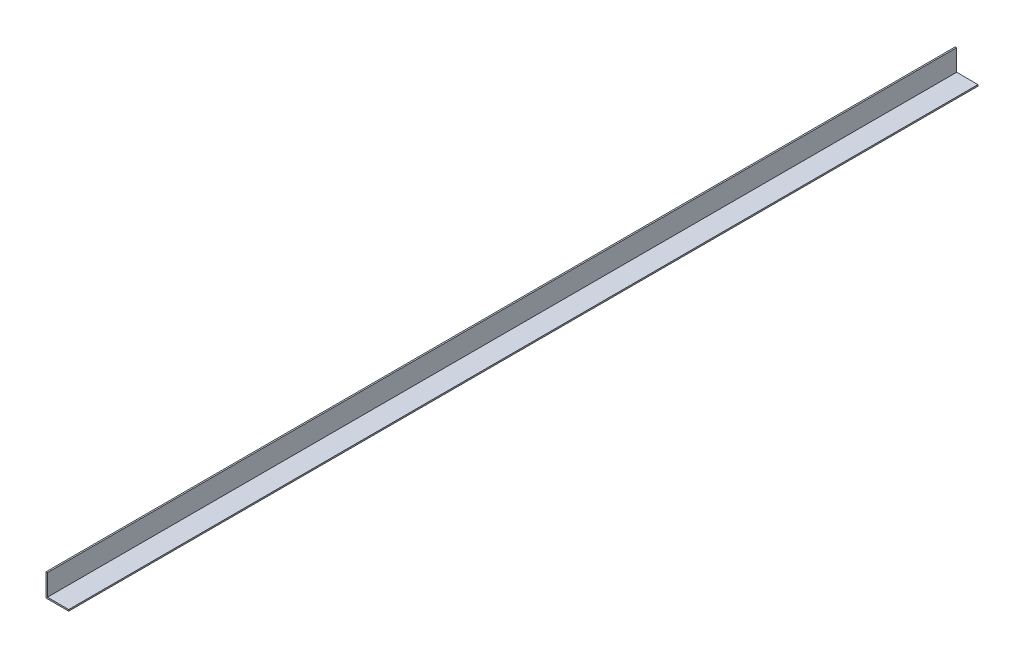
ISO-10303-21;
HEADER;
FILE_DESCRIPTION(('STEP AP214'),'2;1');
FILE_NAME('part.step','',(''),(''),'','','');
FILE_SCHEMA(('AUTOMOTIVE_DESIGN { 1 0 10303 214 1 1 1 1 }'));
ENDSEC;
DATA;
#1=APPLICATION_CONTEXT('core data for automotive mechanical design processes');
#2=APPLICATION_PROTOCOL_DEFINITION('international standard','automotive_design',2000,#1);
#3=PRODUCT_CONTEXT('',#1,'mechanical');
#4=PRODUCT('Part','Part','',(#3));
#5=PRODUCT_RELATED_PRODUCT_CATEGORY('part','',(#4));
#6=PRODUCT_DEFINITION_FORMATION('','',#4);
#7=PRODUCT_DEFINITION_CONTEXT('part definition',#1,'design');
#8=PRODUCT_DEFINITION('design','',#6,#7);
#9=PRODUCT_DEFINITION_SHAPE('','',#8);
#10=(LENGTH_UNIT() NAMED_UNIT(*) SI_UNIT(.MILLI.,.METRE.));
#11=(NAMED_UNIT(*) PLANE_ANGLE_UNIT() SI_UNIT($,.RADIAN.));
#12=(NAMED_UNIT(*) SI_UNIT($,.STERADIAN.) SOLID_ANGLE_UNIT());
#13=UNCERTAINTY_MEASURE_WITH_UNIT(LENGTH_MEASURE(1.E-05),#10,'distance_accuracy_value','');
#14=(GEOMETRIC_REPRESENTATION_CONTEXT(3) GLOBAL_UNCERTAINTY_ASSIGNED_CONTEXT((#13)) GLOBAL_UNIT_ASSIGNED_CONTEXT((#10,
#11,#12)) REPRESENTATION_CONTEXT('',''));
#15=CARTESIAN_POINT('',(0.,0.,0.));
#16=DIRECTION('',(0.,0.,1.));
#17=DIRECTION('',(1.,0.,0.));
#18=AXIS2_PLACEMENT_3D('',#15,#16,#17);
#19=CARTESIAN_POINT('',(1.5875,0.,1016.));
#20=DIRECTION('',(1.,0.,0.));
#21=DIRECTION('',(0.,1.,0.));
#22=AXIS2_PLACEMENT_3D('',#19,#20,#21);
#23=PLANE('',#22);
#24=DIRECTION('',(0.,-1.,0.));
#25=VECTOR('',#24,1.);
#26=CARTESIAN_POINT('',(1.5875,0.,0.));
#27=LINE('',#26,#25);
#28=CARTESIAN_POINT('',(1.5875,25.4,0.));
#29=VERTEX_POINT('',#28);
#30=CARTESIAN_POINT('',(1.5875,1.5875,0.));
#31=VERTEX_POINT('',#30);
#32=EDGE_CURVE('E113',#29,#31,#27,.T.);
#33=ORIENTED_EDGE('',*,*,#32,.F.);
#34=DIRECTION('',(0.,0.,-1.));
#35=VECTOR('',#34,1.);
#36=CARTESIAN_POINT('',(1.5875,25.4,1016.));
#37=LINE('',#36,#35);
#38=CARTESIAN_POINT('',(1.5875,25.4,1016.));
#39=VERTEX_POINT('',#38);
#40=EDGE_CURVE('E11',#39,#29,#37,.T.);
#41=ORIENTED_EDGE('',*,*,#40,.F.);
#42=DIRECTION('',(0.,-1.,0.));
#43=VECTOR('',#42,1.);
#44=CARTESIAN_POINT('',(1.5875,0.,1016.));
#45=LINE('',#44,#43);
#46=CARTESIAN_POINT('',(1.5875,1.5875,1016.));
#47=VERTEX_POINT('',#46);
#48=EDGE_CURVE('E126',#39,#47,#45,.T.);
#49=ORIENTED_EDGE('',*,*,#48,.T.);
#50=DIRECTION('',(0.,0.,-1.));
#51=VECTOR('',#50,1.);
#52=CARTESIAN_POINT('',(1.5875,1.5875,1016.));
#53=LINE('',#52,#51);
#54=EDGE_CURVE('E78',#47,#31,#53,.T.);
#55=ORIENTED_EDGE('',*,*,#54,.T.);
#56=EDGE_LOOP('',(#33,#41,#49,#55));
#57=FACE_BOUND('',#56,.T.);
#58=ADVANCED_FACE('F33',(#57),#23,.T.);
#59=CARTESIAN_POINT('',(0.,25.4,1016.));
#60=DIRECTION('',(0.,1.,0.));
#61=DIRECTION('',(0.,0.,1.));
#62=AXIS2_PLACEMENT_3D('',#59,#60,#61);
#63=PLANE('',#62);
#64=DIRECTION('',(1.,0.,0.));
#65=VECTOR('',#64,1.);
#66=CARTESIAN_POINT('',(0.,25.4,0.));
#67=LINE('',#66,#65);
#68=CARTESIAN_POINT('',(0.,25.4,0.));
#69=VERTEX_POINT('',#68);
#70=EDGE_CURVE('E116',#69,#29,#67,.T.);
#71=ORIENTED_EDGE('',*,*,#70,.F.);
#72=DIRECTION('',(0.,0.,-1.));
#73=VECTOR('',#72,1.);
#74=CARTESIAN_POINT('',(0.,25.4,1016.));
#75=LINE('',#74,#73);
#76=CARTESIAN_POINT('',(0.,25.4,1016.));
#77=VERTEX_POINT('',#76);
#78=EDGE_CURVE('E41',#77,#69,#75,.T.);
#79=ORIENTED_EDGE('',*,*,#78,.F.);
#80=DIRECTION('',(1.,0.,0.));
#81=VECTOR('',#80,1.);
#82=CARTESIAN_POINT('',(0.,25.4,1016.));
#83=LINE('',#82,#81);
#84=EDGE_CURVE('E141',#77,#39,#83,.T.);
#85=ORIENTED_EDGE('',*,*,#84,.T.);
#86=ORIENTED_EDGE('',*,*,#40,.T.);
#87=EDGE_LOOP('',(#71,#79,#85,#86));
#88=FACE_BOUND('',#87,.T.);
#89=ADVANCED_FACE('F135',(#88),#63,.T.);
#90=CARTESIAN_POINT('',(0.,0.,1016.));
#91=DIRECTION('',(-1.,0.,0.));
#92=DIRECTION('',(0.,0.,1.));
#93=AXIS2_PLACEMENT_3D('',#90,#91,#92);
#94=PLANE('',#93);
#95=DIRECTION('',(0.,1.,0.));
#96=VECTOR('',#95,1.);
#97=CARTESIAN_POINT('',(0.,0.,0.));
#98=LINE('',#97,#96);
#99=CARTESIAN_POINT('',(0.,0.,0.));
#100=VERTEX_POINT('',#99);
#101=EDGE_CURVE('E119',#100,#69,#98,.T.);
#102=ORIENTED_EDGE('',*,*,#101,.F.);
#103=DIRECTION('',(0.,0.,-1.));
#104=VECTOR('',#103,1.);
#105=CARTESIAN_POINT('',(0.,0.,1016.));
#106=LINE('',#105,#104);
#107=CARTESIAN_POINT('',(0.,0.,1016.));
#108=VERTEX_POINT('',#107);
#109=EDGE_CURVE('E105',#108,#100,#106,.T.);
#110=ORIENTED_EDGE('',*,*,#109,.F.);
#111=DIRECTION('',(0.,1.,0.));
#112=VECTOR('',#111,1.);
#113=CARTESIAN_POINT('',(0.,0.,1016.));
#114=LINE('',#113,#112);
#115=EDGE_CURVE('E98',#108,#77,#114,.T.);
#116=ORIENTED_EDGE('',*,*,#115,.T.);
#117=ORIENTED_EDGE('',*,*,#78,.T.);
#118=EDGE_LOOP('',(#102,#110,#116,#117));
#119=FACE_BOUND('',#118,.T.);
#120=ADVANCED_FACE('F132',(#119),#94,.T.);
#121=CARTESIAN_POINT('',(0.,0.,1016.));
#122=DIRECTION('',(0.,1.,0.));
#123=DIRECTION('',(0.,0.,1.));
#124=AXIS2_PLACEMENT_3D('',#121,#122,#123);
#125=PLANE('',#124);
#126=DIRECTION('',(1.,0.,0.));
#127=VECTOR('',#126,1.);
#128=CARTESIAN_POINT('',(0.,0.,0.));
#129=LINE('',#128,#127);
#130=CARTESIAN_POINT('',(25.4,0.,0.));
#131=VERTEX_POINT('',#130);
#132=EDGE_CURVE('E104',#100,#131,#129,.T.);
#133=ORIENTED_EDGE('',*,*,#132,.T.);
#134=DIRECTION('',(0.,0.,-1.));
#135=VECTOR('',#134,1.);
#136=CARTESIAN_POINT('',(25.4,0.,1016.));
#137=LINE('',#136,#135);
#138=CARTESIAN_POINT('',(25.4,0.,1016.));
#139=VERTEX_POINT('',#138);
#140=EDGE_CURVE('E101',#139,#131,#137,.T.);
#141=ORIENTED_EDGE('',*,*,#140,.F.);
#142=DIRECTION('',(1.,0.,0.));
#143=VECTOR('',#142,1.);
#144=CARTESIAN_POINT('',(0.,0.,1016.));
#145=LINE('',#144,#143);
#146=EDGE_CURVE('E91',#108,#139,#145,.T.);
#147=ORIENTED_EDGE('',*,*,#146,.F.);
#148=ORIENTED_EDGE('',*,*,#109,.T.);
#149=EDGE_LOOP('',(#133,#141,#147,#148));
#150=FACE_BOUND('',#149,.T.);
#151=ADVANCED_FACE('F102',(#150),#125,.F.);
#152=CARTESIAN_POINT('',(25.4,0.,1016.));
#153=DIRECTION('',(-1.,0.,0.));
#154=DIRECTION('',(0.,0.,1.));
#155=AXIS2_PLACEMENT_3D('',#152,#153,#154);
#156=PLANE('',#155);
#157=DIRECTION('',(0.,1.,0.));
#158=VECTOR('',#157,1.);
#159=CARTESIAN_POINT('',(25.4,0.,0.));
#160=LINE('',#159,#158);
#161=CARTESIAN_POINT('',(25.4,1.5875,0.));
#162=VERTEX_POINT('',#161);
#163=EDGE_CURVE('E71',#131,#162,#160,.T.);
#164=ORIENTED_EDGE('',*,*,#163,.T.);
#165=DIRECTION('',(0.,0.,-1.));
#166=VECTOR('',#165,1.);
#167=CARTESIAN_POINT('',(25.4,1.5875,1016.));
#168=LINE('',#167,#166);
#169=CARTESIAN_POINT('',(25.4,1.5875,1016.));
#170=VERTEX_POINT('',#169);
#171=EDGE_CURVE('E106',#170,#162,#168,.T.);
#172=ORIENTED_EDGE('',*,*,#171,.F.);
#173=DIRECTION('',(0.,1.,0.));
#174=VECTOR('',#173,1.);
#175=CARTESIAN_POINT('',(25.4,0.,1016.));
#176=LINE('',#175,#174);
#177=EDGE_CURVE('E95',#139,#170,#176,.T.);
#178=ORIENTED_EDGE('',*,*,#177,.F.);
#179=ORIENTED_EDGE('',*,*,#140,.T.);
#180=EDGE_LOOP('',(#164,#172,#178,#179));
#181=FACE_BOUND('',#180,.T.);
#182=ADVANCED_FACE('F108',(#181),#156,.F.);
#183=CARTESIAN_POINT('',(0.,1.5875,1016.));
#184=DIRECTION('',(0.,-1.,0.));
#185=DIRECTION('',(1.,0.,0.));
#186=AXIS2_PLACEMENT_3D('',#183,#184,#185);
#187=PLANE('',#186);
#188=DIRECTION('',(-1.,0.,0.));
#189=VECTOR('',#188,1.);
#190=CARTESIAN_POINT('',(0.,1.5875,0.));
#191=LINE('',#190,#189);
#192=EDGE_CURVE('E124',#162,#31,#191,.T.);
#193=ORIENTED_EDGE('',*,*,#192,.T.);
#194=ORIENTED_EDGE('',*,*,#54,.F.);
#195=DIRECTION('',(-1.,0.,0.));
#196=VECTOR('',#195,1.);
#197=CARTESIAN_POINT('',(0.,1.5875,1016.));
#198=LINE('',#197,#196);
#199=EDGE_CURVE('E49',#170,#47,#198,.T.);
#200=ORIENTED_EDGE('',*,*,#199,.F.);
#201=ORIENTED_EDGE('',*,*,#171,.T.);
#202=EDGE_LOOP('',(#193,#194,#200,#201));
#203=FACE_BOUND('',#202,.T.);
#204=ADVANCED_FACE('F140',(#203),#187,.F.);
#205=CARTESIAN_POINT('',(0.,0.,1016.));
#206=DIRECTION('',(0.,0.,1.));
#207=DIRECTION('',(1.,0.,0.));
#208=AXIS2_PLACEMENT_3D('',#205,#206,#207);
#209=PLANE('',#208);
#210=ORIENTED_EDGE('',*,*,#48,.F.);
#211=ORIENTED_EDGE('',*,*,#84,.F.);
#212=ORIENTED_EDGE('',*,*,#115,.F.);
#213=ORIENTED_EDGE('',*,*,#146,.T.);
#214=ORIENTED_EDGE('',*,*,#177,.T.);
#215=ORIENTED_EDGE('',*,*,#199,.T.);
#216=EDGE_LOOP('',(#210,#211,#212,#213,#214,#215));
#217=FACE_BOUND('',#216,.T.);
#218=ADVANCED_FACE('F93',(#217),#209,.T.);
#219=CARTESIAN_POINT('',(0.,0.,0.));
#220=DIRECTION('',(0.,0.,1.));
#221=DIRECTION('',(1.,0.,0.));
#222=AXIS2_PLACEMENT_3D('',#219,#220,#221);
#223=PLANE('',#222);
#224=ORIENTED_EDGE('',*,*,#32,.T.);
#225=ORIENTED_EDGE('',*,*,#192,.F.);
#226=ORIENTED_EDGE('',*,*,#163,.F.);
#227=ORIENTED_EDGE('',*,*,#132,.F.);
#228=ORIENTED_EDGE('',*,*,#101,.T.);
#229=ORIENTED_EDGE('',*,*,#70,.T.);
#230=EDGE_LOOP('',(#224,#225,#226,#227,#228,#229));
#231=FACE_BOUND('',#230,.T.);
#232=ADVANCED_FACE('F137',(#231),#223,.F.);
#233=CLOSED_SHELL('',(#58,#89,#120,#151,#182,#204,#218,#232));
#234=MANIFOLD_SOLID_BREP('B2',#233);
#235=ADVANCED_BREP_SHAPE_REPRESENTATION('',(#18,#234),#14);
#236=SHAPE_DEFINITION_REPRESENTATION(#9,#235);
ENDSEC;
END-ISO-10303-21;
